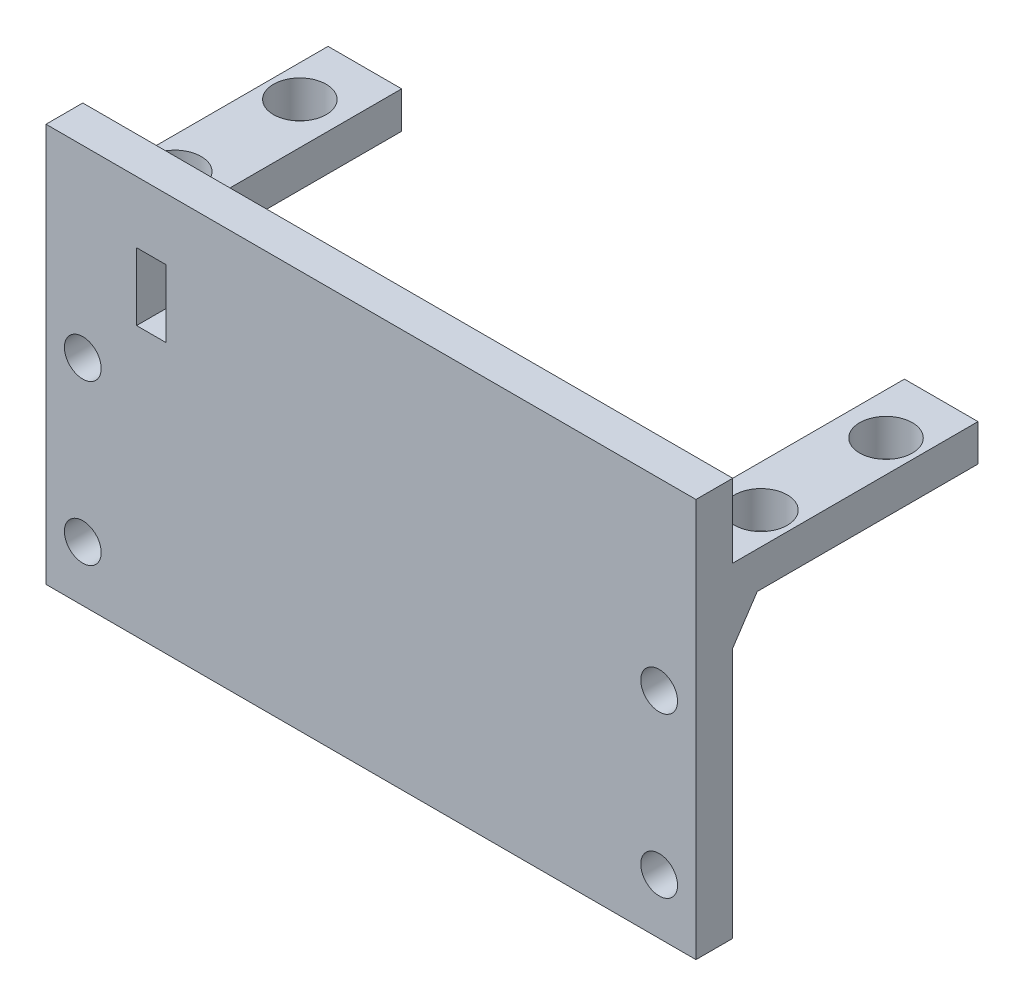
ISO-10303-21;
HEADER;
FILE_DESCRIPTION(('STEP AP214'),'2;1');
FILE_NAME('part.step','',(''),(''),'','','');
FILE_SCHEMA(('AUTOMOTIVE_DESIGN { 1 0 10303 214 1 1 1 1 }'));
ENDSEC;
DATA;
#1=APPLICATION_CONTEXT('core data for automotive mechanical design processes');
#2=APPLICATION_PROTOCOL_DEFINITION('international standard','automotive_design',2000,#1);
#3=PRODUCT_CONTEXT('',#1,'mechanical');
#4=PRODUCT('Part','Part','',(#3));
#5=PRODUCT_RELATED_PRODUCT_CATEGORY('part','',(#4));
#6=PRODUCT_DEFINITION_FORMATION('','',#4);
#7=PRODUCT_DEFINITION_CONTEXT('part definition',#1,'design');
#8=PRODUCT_DEFINITION('design','',#6,#7);
#9=PRODUCT_DEFINITION_SHAPE('','',#8);
#10=(LENGTH_UNIT() NAMED_UNIT(*) SI_UNIT(.MILLI.,.METRE.));
#11=(NAMED_UNIT(*) PLANE_ANGLE_UNIT() SI_UNIT($,.RADIAN.));
#12=(NAMED_UNIT(*) SI_UNIT($,.STERADIAN.) SOLID_ANGLE_UNIT());
#13=UNCERTAINTY_MEASURE_WITH_UNIT(LENGTH_MEASURE(1.E-05),#10,'distance_accuracy_value','');
#14=(GEOMETRIC_REPRESENTATION_CONTEXT(3) GLOBAL_UNCERTAINTY_ASSIGNED_CONTEXT((#13)) GLOBAL_UNIT_ASSIGNED_CONTEXT((#10,
#11,#12)) REPRESENTATION_CONTEXT('',''));
#15=CARTESIAN_POINT('',(0.,0.,0.));
#16=DIRECTION('',(0.,0.,1.));
#17=DIRECTION('',(1.,0.,0.));
#18=AXIS2_PLACEMENT_3D('',#15,#16,#17);
#19=CARTESIAN_POINT('',(0.,0.,0.));
#20=DIRECTION('',(0.,0.,1.));
#21=DIRECTION('',(1.,0.,0.));
#22=AXIS2_PLACEMENT_3D('',#19,#20,#21);
#23=PLANE('',#22);
#24=CARTESIAN_POINT('',(-13.7596567795015,4.56034482758562,0.));
#25=DIRECTION('',(0.,0.,-1.));
#26=DIRECTION('',(-1.,0.,0.));
#27=AXIS2_PLACEMENT_3D('',#24,#25,#26);
#28=CIRCLE('',#27,1.5);
#29=CARTESIAN_POINT('',(-15.2596567795015,4.56034482758562,0.));
#30=VERTEX_POINT('',#29);
#31=EDGE_CURVE('E388',#30,#30,#28,.T.);
#32=ORIENTED_EDGE('',*,*,#31,.F.);
#33=EDGE_LOOP('',(#32));
#34=FACE_BOUND('',#33,.T.);
#35=CARTESIAN_POINT('',(-13.7596567795015,-8.43965517241438,0.));
#36=DIRECTION('',(0.,0.,-1.));
#37=DIRECTION('',(-1.,0.,0.));
#38=AXIS2_PLACEMENT_3D('',#35,#36,#37);
#39=CIRCLE('',#38,1.5);
#40=CARTESIAN_POINT('',(-15.2596567795015,-8.43965517241438,0.));
#41=VERTEX_POINT('',#40);
#42=EDGE_CURVE('E386',#41,#41,#39,.T.);
#43=ORIENTED_EDGE('',*,*,#42,.F.);
#44=EDGE_LOOP('',(#43));
#45=FACE_BOUND('',#44,.T.);
#46=CARTESIAN_POINT('',(33.2403432204985,-8.43965517241438,0.));
#47=DIRECTION('',(0.,0.,-1.));
#48=DIRECTION('',(-1.,0.,0.));
#49=AXIS2_PLACEMENT_3D('',#46,#47,#48);
#50=CIRCLE('',#49,1.5);
#51=CARTESIAN_POINT('',(31.7403432204985,-8.43965517241438,0.));
#52=VERTEX_POINT('',#51);
#53=EDGE_CURVE('E383',#52,#52,#50,.T.);
#54=ORIENTED_EDGE('',*,*,#53,.F.);
#55=EDGE_LOOP('',(#54));
#56=FACE_BOUND('',#55,.T.);
#57=CARTESIAN_POINT('',(33.2403432204985,4.56034482758562,0.));
#58=DIRECTION('',(0.,0.,-1.));
#59=DIRECTION('',(-1.,0.,0.));
#60=AXIS2_PLACEMENT_3D('',#57,#58,#59);
#61=CIRCLE('',#60,1.5);
#62=CARTESIAN_POINT('',(31.7403432204985,4.56034482758562,0.));
#63=VERTEX_POINT('',#62);
#64=EDGE_CURVE('E255',#63,#63,#61,.T.);
#65=ORIENTED_EDGE('',*,*,#64,.F.);
#66=EDGE_LOOP('',(#65));
#67=FACE_BOUND('',#66,.T.);
#68=DIRECTION('',(0.,1.,0.));
#69=VECTOR('',#68,1.);
#70=CARTESIAN_POINT('',(30.2403432204985,10.5603448275856,0.));
#71=LINE('',#70,#69);
#72=CARTESIAN_POINT('',(30.2403432204985,7.56034482758562,0.));
#73=VERTEX_POINT('',#72);
#74=CARTESIAN_POINT('',(30.2403432204985,13.5603448275856,0.));
#75=VERTEX_POINT('',#74);
#76=EDGE_CURVE('E326',#73,#75,#71,.T.);
#77=ORIENTED_EDGE('',*,*,#76,.F.);
#78=DIRECTION('',(1.,0.,0.));
#79=VECTOR('',#78,1.);
#80=CARTESIAN_POINT('',(26.6347919450345,7.56034482758562,0.));
#81=LINE('',#80,#79);
#82=CARTESIAN_POINT('',(36.2403432204985,7.56034482758562,0.));
#83=VERTEX_POINT('',#82);
#84=EDGE_CURVE('E185',#73,#83,#81,.T.);
#85=ORIENTED_EDGE('',*,*,#84,.T.);
#86=DIRECTION('',(0.,1.,0.));
#87=VECTOR('',#86,1.);
#88=CARTESIAN_POINT('',(36.2403432204985,19.5603448275856,0.));
#89=LINE('',#88,#87);
#90=CARTESIAN_POINT('',(36.2403432204985,-12.9396551724144,0.));
#91=VERTEX_POINT('',#90);
#92=EDGE_CURVE('E195',#91,#83,#89,.T.);
#93=ORIENTED_EDGE('',*,*,#92,.F.);
#94=DIRECTION('',(1.,0.,0.));
#95=VECTOR('',#94,1.);
#96=CARTESIAN_POINT('',(-16.7596567795015,-12.9396551724144,0.));
#97=LINE('',#96,#95);
#98=CARTESIAN_POINT('',(-16.7596567795015,-12.9396551724144,0.));
#99=VERTEX_POINT('',#98);
#100=EDGE_CURVE('E220',#99,#91,#97,.T.);
#101=ORIENTED_EDGE('',*,*,#100,.F.);
#102=DIRECTION('',(0.,-1.,0.));
#103=VECTOR('',#102,1.);
#104=CARTESIAN_POINT('',(-16.7596567795015,19.5603448275856,0.));
#105=LINE('',#104,#103);
#106=CARTESIAN_POINT('',(-16.7596567795015,7.56034482758562,0.));
#107=VERTEX_POINT('',#106);
#108=EDGE_CURVE('E69',#107,#99,#105,.T.);
#109=ORIENTED_EDGE('',*,*,#108,.F.);
#110=DIRECTION('',(-1.,0.,0.));
#111=VECTOR('',#110,1.);
#112=CARTESIAN_POINT('',(-7.15410550403751,7.56034482758562,0.));
#113=LINE('',#112,#111);
#114=CARTESIAN_POINT('',(-10.7596567795015,7.56034482758562,0.));
#115=VERTEX_POINT('',#114);
#116=EDGE_CURVE('E374',#115,#107,#113,.T.);
#117=ORIENTED_EDGE('',*,*,#116,.F.);
#118=DIRECTION('',(0.,-1.,0.));
#119=VECTOR('',#118,1.);
#120=CARTESIAN_POINT('',(-10.7596567795015,13.5603448275856,0.));
#121=LINE('',#120,#119);
#122=CARTESIAN_POINT('',(-10.7596567795015,13.5603448275856,0.));
#123=VERTEX_POINT('',#122);
#124=EDGE_CURVE('E62',#123,#115,#121,.T.);
#125=ORIENTED_EDGE('',*,*,#124,.F.);
#126=DIRECTION('',(1.,0.,0.));
#127=VECTOR('',#126,1.);
#128=CARTESIAN_POINT('',(-16.7596567795015,13.5603448275856,0.));
#129=LINE('',#128,#127);
#130=CARTESIAN_POINT('',(-16.7596567795015,13.5603448275856,0.));
#131=VERTEX_POINT('',#130);
#132=EDGE_CURVE('E305',#131,#123,#129,.T.);
#133=ORIENTED_EDGE('',*,*,#132,.F.);
#134=CARTESIAN_POINT('',(-16.7596567795015,19.5603448275856,0.));
#135=VERTEX_POINT('',#134);
#136=EDGE_CURVE('E202',#135,#131,#105,.T.);
#137=ORIENTED_EDGE('',*,*,#136,.F.);
#138=DIRECTION('',(-1.,0.,0.));
#139=VECTOR('',#138,1.);
#140=CARTESIAN_POINT('',(-16.7596567795015,19.5603448275856,0.));
#141=LINE('',#140,#139);
#142=CARTESIAN_POINT('',(36.2403432204985,19.5603448275856,0.));
#143=VERTEX_POINT('',#142);
#144=EDGE_CURVE('E212',#143,#135,#141,.T.);
#145=ORIENTED_EDGE('',*,*,#144,.F.);
#146=CARTESIAN_POINT('',(36.2403432204985,13.5603448275856,0.));
#147=VERTEX_POINT('',#146);
#148=EDGE_CURVE('E222',#147,#143,#89,.T.);
#149=ORIENTED_EDGE('',*,*,#148,.F.);
#150=DIRECTION('',(1.,0.,0.));
#151=VECTOR('',#150,1.);
#152=CARTESIAN_POINT('',(36.2403432204985,13.5603448275856,0.));
#153=LINE('',#152,#151);
#154=EDGE_CURVE('E329',#75,#147,#153,.T.);
#155=ORIENTED_EDGE('',*,*,#154,.F.);
#156=EDGE_LOOP('',(#77,#85,#93,#101,#109,#117,#125,#133,#137,#145,#149,#155));
#157=FACE_BOUND('',#156,.T.);
#158=DIRECTION('',(0.,1.,0.));
#159=VECTOR('',#158,1.);
#160=CARTESIAN_POINT('',(-6.97278194106482,9.03354912706477,0.));
#161=LINE('',#160,#159);
#162=CARTESIAN_POINT('',(-6.97278194106482,9.03354912706477,0.));
#163=VERTEX_POINT('',#162);
#164=CARTESIAN_POINT('',(-6.97278194106482,14.5335491270648,0.));
#165=VERTEX_POINT('',#164);
#166=EDGE_CURVE('E262',#163,#165,#161,.T.);
#167=ORIENTED_EDGE('',*,*,#166,.T.);
#168=DIRECTION('',(-1.,0.,0.));
#169=VECTOR('',#168,1.);
#170=CARTESIAN_POINT('',(-6.97278194106482,14.5335491270648,0.));
#171=LINE('',#170,#169);
#172=CARTESIAN_POINT('',(-9.37278194106482,14.5335491270648,0.));
#173=VERTEX_POINT('',#172);
#174=EDGE_CURVE('E266',#165,#173,#171,.T.);
#175=ORIENTED_EDGE('',*,*,#174,.T.);
#176=DIRECTION('',(0.,-1.,0.));
#177=VECTOR('',#176,1.);
#178=CARTESIAN_POINT('',(-9.37278194106482,14.5335491270648,0.));
#179=LINE('',#178,#177);
#180=CARTESIAN_POINT('',(-9.37278194106482,9.03354912706477,0.));
#181=VERTEX_POINT('',#180);
#182=EDGE_CURVE('E271',#173,#181,#179,.T.);
#183=ORIENTED_EDGE('',*,*,#182,.T.);
#184=DIRECTION('',(1.,0.,0.));
#185=VECTOR('',#184,1.);
#186=CARTESIAN_POINT('',(-9.37278194106482,9.03354912706477,0.));
#187=LINE('',#186,#185);
#188=EDGE_CURVE('E278',#181,#163,#187,.T.);
#189=ORIENTED_EDGE('',*,*,#188,.T.);
#190=EDGE_LOOP('',(#167,#175,#183,#189));
#191=FACE_BOUND('',#190,.T.);
#192=ADVANCED_FACE('F45',(#34,#45,#56,#67,#157,#191),#23,.F.);
#193=CARTESIAN_POINT('',(0.,0.,3.));
#194=DIRECTION('',(0.,0.,1.));
#195=DIRECTION('',(1.,0.,0.));
#196=AXIS2_PLACEMENT_3D('',#193,#194,#195);
#197=PLANE('',#196);
#198=CARTESIAN_POINT('',(-13.7596567795015,4.56034482758562,3.));
#199=DIRECTION('',(0.,0.,1.));
#200=DIRECTION('',(1.,0.,0.));
#201=AXIS2_PLACEMENT_3D('',#198,#199,#200);
#202=CIRCLE('',#201,1.5);
#203=CARTESIAN_POINT('',(-12.2596567795015,4.56034482758562,3.));
#204=VERTEX_POINT('',#203);
#205=EDGE_CURVE('E49',#204,#204,#202,.T.);
#206=ORIENTED_EDGE('',*,*,#205,.F.);
#207=EDGE_LOOP('',(#206));
#208=FACE_BOUND('',#207,.T.);
#209=CARTESIAN_POINT('',(-13.7596567795015,-8.43965517241438,3.));
#210=DIRECTION('',(0.,0.,1.));
#211=DIRECTION('',(1.,0.,0.));
#212=AXIS2_PLACEMENT_3D('',#209,#210,#211);
#213=CIRCLE('',#212,1.5);
#214=CARTESIAN_POINT('',(-12.2596567795015,-8.43965517241438,3.));
#215=VERTEX_POINT('',#214);
#216=EDGE_CURVE('E257',#215,#215,#213,.T.);
#217=ORIENTED_EDGE('',*,*,#216,.F.);
#218=EDGE_LOOP('',(#217));
#219=FACE_BOUND('',#218,.T.);
#220=CARTESIAN_POINT('',(33.2403432204985,-8.43965517241438,3.));
#221=DIRECTION('',(0.,0.,1.));
#222=DIRECTION('',(1.,0.,0.));
#223=AXIS2_PLACEMENT_3D('',#220,#221,#222);
#224=CIRCLE('',#223,1.5);
#225=CARTESIAN_POINT('',(34.7403432204985,-8.43965517241438,3.));
#226=VERTEX_POINT('',#225);
#227=EDGE_CURVE('E254',#226,#226,#224,.T.);
#228=ORIENTED_EDGE('',*,*,#227,.F.);
#229=EDGE_LOOP('',(#228));
#230=FACE_BOUND('',#229,.T.);
#231=CARTESIAN_POINT('',(33.2403432204985,4.56034482758562,3.));
#232=DIRECTION('',(0.,0.,1.));
#233=DIRECTION('',(1.,0.,0.));
#234=AXIS2_PLACEMENT_3D('',#231,#232,#233);
#235=CIRCLE('',#234,1.5);
#236=CARTESIAN_POINT('',(34.7403432204985,4.56034482758562,3.));
#237=VERTEX_POINT('',#236);
#238=EDGE_CURVE('E251',#237,#237,#235,.T.);
#239=ORIENTED_EDGE('',*,*,#238,.F.);
#240=EDGE_LOOP('',(#239));
#241=FACE_BOUND('',#240,.T.);
#242=DIRECTION('',(0.,-1.,0.));
#243=VECTOR('',#242,1.);
#244=CARTESIAN_POINT('',(-16.7596567795015,19.5603448275856,3.));
#245=LINE('',#244,#243);
#246=CARTESIAN_POINT('',(-16.7596567795015,19.5603448275856,3.));
#247=VERTEX_POINT('',#246);
#248=CARTESIAN_POINT('',(-16.7596567795015,-12.9396551724144,3.));
#249=VERTEX_POINT('',#248);
#250=EDGE_CURVE('E208',#247,#249,#245,.T.);
#251=ORIENTED_EDGE('',*,*,#250,.T.);
#252=DIRECTION('',(1.,0.,0.));
#253=VECTOR('',#252,1.);
#254=CARTESIAN_POINT('',(-16.7596567795015,-12.9396551724144,3.));
#255=LINE('',#254,#253);
#256=CARTESIAN_POINT('',(36.2403432204985,-12.9396551724144,3.));
#257=VERTEX_POINT('',#256);
#258=EDGE_CURVE('E211',#249,#257,#255,.T.);
#259=ORIENTED_EDGE('',*,*,#258,.T.);
#260=DIRECTION('',(0.,1.,0.));
#261=VECTOR('',#260,1.);
#262=CARTESIAN_POINT('',(36.2403432204985,19.5603448275856,3.));
#263=LINE('',#262,#261);
#264=CARTESIAN_POINT('',(36.2403432204985,19.5603448275856,3.));
#265=VERTEX_POINT('',#264);
#266=EDGE_CURVE('E214',#257,#265,#263,.T.);
#267=ORIENTED_EDGE('',*,*,#266,.T.);
#268=DIRECTION('',(-1.,0.,0.));
#269=VECTOR('',#268,1.);
#270=CARTESIAN_POINT('',(-16.7596567795015,19.5603448275856,3.));
#271=LINE('',#270,#269);
#272=EDGE_CURVE('E216',#265,#247,#271,.T.);
#273=ORIENTED_EDGE('',*,*,#272,.T.);
#274=EDGE_LOOP('',(#251,#259,#267,#273));
#275=FACE_BOUND('',#274,.T.);
#276=DIRECTION('',(1.,0.,0.));
#277=VECTOR('',#276,1.);
#278=CARTESIAN_POINT('',(0.,14.5335491270648,3.));
#279=LINE('',#278,#277);
#280=CARTESIAN_POINT('',(-9.37278194106482,14.5335491270648,3.));
#281=VERTEX_POINT('',#280);
#282=CARTESIAN_POINT('',(-6.97278194106482,14.5335491270648,3.));
#283=VERTEX_POINT('',#282);
#284=EDGE_CURVE('E54',#281,#283,#279,.T.);
#285=ORIENTED_EDGE('',*,*,#284,.T.);
#286=DIRECTION('',(0.,-1.,0.));
#287=VECTOR('',#286,1.);
#288=CARTESIAN_POINT('',(-6.97278194106482,0.,3.));
#289=LINE('',#288,#287);
#290=CARTESIAN_POINT('',(-6.97278194106482,9.03354912706477,3.));
#291=VERTEX_POINT('',#290);
#292=EDGE_CURVE('E13',#283,#291,#289,.T.);
#293=ORIENTED_EDGE('',*,*,#292,.T.);
#294=DIRECTION('',(-1.,0.,0.));
#295=VECTOR('',#294,1.);
#296=CARTESIAN_POINT('',(0.,9.03354912706477,3.));
#297=LINE('',#296,#295);
#298=CARTESIAN_POINT('',(-9.37278194106482,9.03354912706477,3.));
#299=VERTEX_POINT('',#298);
#300=EDGE_CURVE('E235',#291,#299,#297,.T.);
#301=ORIENTED_EDGE('',*,*,#300,.T.);
#302=DIRECTION('',(0.,1.,0.));
#303=VECTOR('',#302,1.);
#304=CARTESIAN_POINT('',(-9.37278194106482,0.,3.));
#305=LINE('',#304,#303);
#306=EDGE_CURVE('E246',#299,#281,#305,.T.);
#307=ORIENTED_EDGE('',*,*,#306,.T.);
#308=EDGE_LOOP('',(#285,#293,#301,#307));
#309=FACE_BOUND('',#308,.T.);
#310=ADVANCED_FACE('F360',(#208,#219,#230,#241,#275,#309),#197,.T.);
#311=CARTESIAN_POINT('',(-16.7596567795015,19.5603448275856,3.));
#312=DIRECTION('',(1.,0.,0.));
#313=DIRECTION('',(0.,1.,0.));
#314=AXIS2_PLACEMENT_3D('',#311,#312,#313);
#315=PLANE('',#314);
#316=DIRECTION('',(0.,-0.832050294337844,0.554700196225229));
#317=VECTOR('',#316,1.);
#318=CARTESIAN_POINT('',(-16.7596567795015,7.56034482758562,0.));
#319=LINE('',#318,#317);
#320=CARTESIAN_POINT('',(-16.7596567795015,10.5603448275856,-2.));
#321=VERTEX_POINT('',#320);
#322=EDGE_CURVE('E369',#321,#107,#319,.T.);
#323=ORIENTED_EDGE('',*,*,#322,.T.);
#324=ORIENTED_EDGE('',*,*,#108,.T.);
#325=DIRECTION('',(0.,0.,-1.));
#326=VECTOR('',#325,1.);
#327=CARTESIAN_POINT('',(-16.7596567795015,-12.9396551724144,3.));
#328=LINE('',#327,#326);
#329=EDGE_CURVE('E232',#249,#99,#328,.T.);
#330=ORIENTED_EDGE('',*,*,#329,.F.);
#331=ORIENTED_EDGE('',*,*,#250,.F.);
#332=DIRECTION('',(0.,0.,-1.));
#333=VECTOR('',#332,1.);
#334=CARTESIAN_POINT('',(-16.7596567795015,19.5603448275856,3.));
#335=LINE('',#334,#333);
#336=EDGE_CURVE('E217',#247,#135,#335,.T.);
#337=ORIENTED_EDGE('',*,*,#336,.T.);
#338=ORIENTED_EDGE('',*,*,#136,.T.);
#339=DIRECTION('',(0.,0.,1.));
#340=VECTOR('',#339,1.);
#341=CARTESIAN_POINT('',(-16.7596567795015,13.5603448275856,-20.));
#342=LINE('',#341,#340);
#343=CARTESIAN_POINT('',(-16.7596567795015,13.5603448275856,-20.));
#344=VERTEX_POINT('',#343);
#345=EDGE_CURVE('E324',#344,#131,#342,.T.);
#346=ORIENTED_EDGE('',*,*,#345,.F.);
#347=DIRECTION('',(0.,1.,0.));
#348=VECTOR('',#347,1.);
#349=CARTESIAN_POINT('',(-16.7596567795015,13.5603448275856,-20.));
#350=LINE('',#349,#348);
#351=CARTESIAN_POINT('',(-16.7596567795015,10.5603448275856,-20.));
#352=VERTEX_POINT('',#351);
#353=EDGE_CURVE('E306',#352,#344,#350,.T.);
#354=ORIENTED_EDGE('',*,*,#353,.F.);
#355=DIRECTION('',(0.,0.,1.));
#356=VECTOR('',#355,1.);
#357=CARTESIAN_POINT('',(-16.7596567795015,10.5603448275856,-20.));
#358=LINE('',#357,#356);
#359=EDGE_CURVE('E315',#352,#321,#358,.T.);
#360=ORIENTED_EDGE('',*,*,#359,.T.);
#361=EDGE_LOOP('',(#323,#324,#330,#331,#337,#338,#346,#354,#360));
#362=FACE_BOUND('',#361,.T.);
#363=ADVANCED_FACE('F47',(#362),#315,.F.);
#364=CARTESIAN_POINT('',(-16.7596567795015,-12.9396551724144,3.));
#365=DIRECTION('',(0.,1.,0.));
#366=DIRECTION('',(0.,0.,1.));
#367=AXIS2_PLACEMENT_3D('',#364,#365,#366);
#368=PLANE('',#367);
#369=ORIENTED_EDGE('',*,*,#100,.T.);
#370=DIRECTION('',(0.,0.,-1.));
#371=VECTOR('',#370,1.);
#372=CARTESIAN_POINT('',(36.2403432204985,-12.9396551724144,3.));
#373=LINE('',#372,#371);
#374=EDGE_CURVE('E230',#257,#91,#373,.T.);
#375=ORIENTED_EDGE('',*,*,#374,.F.);
#376=ORIENTED_EDGE('',*,*,#258,.F.);
#377=ORIENTED_EDGE('',*,*,#329,.T.);
#378=EDGE_LOOP('',(#369,#375,#376,#377));
#379=FACE_BOUND('',#378,.T.);
#380=ADVANCED_FACE('F365',(#379),#368,.F.);
#381=CARTESIAN_POINT('',(36.2403432204985,19.5603448275856,3.));
#382=DIRECTION('',(-1.,0.,0.));
#383=DIRECTION('',(0.,-1.,0.));
#384=AXIS2_PLACEMENT_3D('',#381,#382,#383);
#385=PLANE('',#384);
#386=ORIENTED_EDGE('',*,*,#92,.T.);
#387=DIRECTION('',(0.,0.832050294337844,-0.554700196225229));
#388=VECTOR('',#387,1.);
#389=CARTESIAN_POINT('',(36.2403432204985,7.56034482758562,0.));
#390=LINE('',#389,#388);
#391=CARTESIAN_POINT('',(36.2403432204985,10.5603448275856,-2.));
#392=VERTEX_POINT('',#391);
#393=EDGE_CURVE('E177',#83,#392,#390,.T.);
#394=ORIENTED_EDGE('',*,*,#393,.T.);
#395=DIRECTION('',(0.,0.,1.));
#396=VECTOR('',#395,1.);
#397=CARTESIAN_POINT('',(36.2403432204985,10.5603448275856,-20.));
#398=LINE('',#397,#396);
#399=CARTESIAN_POINT('',(36.2403432204985,10.5603448275856,-20.));
#400=VERTEX_POINT('',#399);
#401=EDGE_CURVE('E192',#400,#392,#398,.T.);
#402=ORIENTED_EDGE('',*,*,#401,.F.);
#403=DIRECTION('',(0.,-1.,0.));
#404=VECTOR('',#403,1.);
#405=CARTESIAN_POINT('',(36.2403432204985,10.5603448275856,-20.));
#406=LINE('',#405,#404);
#407=CARTESIAN_POINT('',(36.2403432204985,13.5603448275856,-20.));
#408=VERTEX_POINT('',#407);
#409=EDGE_CURVE('E327',#408,#400,#406,.T.);
#410=ORIENTED_EDGE('',*,*,#409,.F.);
#411=DIRECTION('',(0.,0.,1.));
#412=VECTOR('',#411,1.);
#413=CARTESIAN_POINT('',(36.2403432204985,13.5603448275856,-20.));
#414=LINE('',#413,#412);
#415=EDGE_CURVE('E335',#408,#147,#414,.T.);
#416=ORIENTED_EDGE('',*,*,#415,.T.);
#417=ORIENTED_EDGE('',*,*,#148,.T.);
#418=DIRECTION('',(0.,0.,-1.));
#419=VECTOR('',#418,1.);
#420=CARTESIAN_POINT('',(36.2403432204985,19.5603448275856,3.));
#421=LINE('',#420,#419);
#422=EDGE_CURVE('E227',#265,#143,#421,.T.);
#423=ORIENTED_EDGE('',*,*,#422,.F.);
#424=ORIENTED_EDGE('',*,*,#266,.F.);
#425=ORIENTED_EDGE('',*,*,#374,.T.);
#426=EDGE_LOOP('',(#386,#394,#402,#410,#416,#417,#423,#424,#425));
#427=FACE_BOUND('',#426,.T.);
#428=ADVANCED_FACE('F190',(#427),#385,.F.);
#429=CARTESIAN_POINT('',(-16.7596567795015,19.5603448275856,3.));
#430=DIRECTION('',(0.,-1.,0.));
#431=DIRECTION('',(0.,0.,-1.));
#432=AXIS2_PLACEMENT_3D('',#429,#430,#431);
#433=PLANE('',#432);
#434=ORIENTED_EDGE('',*,*,#144,.T.);
#435=ORIENTED_EDGE('',*,*,#336,.F.);
#436=ORIENTED_EDGE('',*,*,#272,.F.);
#437=ORIENTED_EDGE('',*,*,#422,.T.);
#438=EDGE_LOOP('',(#434,#435,#436,#437));
#439=FACE_BOUND('',#438,.T.);
#440=ADVANCED_FACE('F356',(#439),#433,.F.);
#441=CARTESIAN_POINT('',(36.2403432204985,10.5603448275856,-20.));
#442=DIRECTION('',(0.,1.,0.));
#443=DIRECTION('',(0.,0.,1.));
#444=AXIS2_PLACEMENT_3D('',#441,#442,#443);
#445=PLANE('',#444);
#446=CARTESIAN_POINT('',(33.6403432204985,10.5603448275856,-15.0999999999998));
#447=DIRECTION('',(0.,1.,0.));
#448=DIRECTION('',(0.,0.,1.));
#449=AXIS2_PLACEMENT_3D('',#446,#447,#448);
#450=CIRCLE('',#449,2.15);
#451=CARTESIAN_POINT('',(33.6403432204985,10.5603448275856,-12.9499999999998));
#452=VERTEX_POINT('',#451);
#453=EDGE_CURVE('E302',#452,#452,#450,.T.);
#454=ORIENTED_EDGE('',*,*,#453,.T.);
#455=EDGE_LOOP('',(#454));
#456=FACE_BOUND('',#455,.T.);
#457=CARTESIAN_POINT('',(33.6403432204985,10.5603448275856,-4.89999999999984));
#458=DIRECTION('',(0.,1.,0.));
#459=DIRECTION('',(0.,0.,1.));
#460=AXIS2_PLACEMENT_3D('',#457,#458,#459);
#461=CIRCLE('',#460,2.15);
#462=CARTESIAN_POINT('',(33.6403432204985,10.5603448275856,-2.74999999999984));
#463=VERTEX_POINT('',#462);
#464=EDGE_CURVE('E243',#463,#463,#461,.T.);
#465=ORIENTED_EDGE('',*,*,#464,.T.);
#466=EDGE_LOOP('',(#465));
#467=FACE_BOUND('',#466,.T.);
#468=ORIENTED_EDGE('',*,*,#401,.T.);
#469=DIRECTION('',(1.,0.,0.));
#470=VECTOR('',#469,1.);
#471=CARTESIAN_POINT('',(26.6347919450345,10.5603448275856,-2.));
#472=LINE('',#471,#470);
#473=CARTESIAN_POINT('',(30.2403432204985,10.5603448275856,-2.));
#474=VERTEX_POINT('',#473);
#475=EDGE_CURVE('E173',#474,#392,#472,.T.);
#476=ORIENTED_EDGE('',*,*,#475,.F.);
#477=DIRECTION('',(0.,0.,1.));
#478=VECTOR('',#477,1.);
#479=CARTESIAN_POINT('',(30.2403432204985,10.5603448275856,-20.));
#480=LINE('',#479,#478);
#481=CARTESIAN_POINT('',(30.2403432204985,10.5603448275856,-20.));
#482=VERTEX_POINT('',#481);
#483=EDGE_CURVE('E200',#482,#474,#480,.T.);
#484=ORIENTED_EDGE('',*,*,#483,.F.);
#485=DIRECTION('',(-1.,0.,0.));
#486=VECTOR('',#485,1.);
#487=CARTESIAN_POINT('',(36.2403432204985,10.5603448275856,-20.));
#488=LINE('',#487,#486);
#489=EDGE_CURVE('E198',#400,#482,#488,.T.);
#490=ORIENTED_EDGE('',*,*,#489,.F.);
#491=EDGE_LOOP('',(#468,#476,#484,#490));
#492=FACE_BOUND('',#491,.T.);
#493=ADVANCED_FACE('F197',(#456,#467,#492),#445,.F.);
#494=CARTESIAN_POINT('',(30.2403432204985,10.5603448275856,-20.));
#495=DIRECTION('',(1.,0.,0.));
#496=DIRECTION('',(0.,0.,-1.));
#497=AXIS2_PLACEMENT_3D('',#494,#495,#496);
#498=PLANE('',#497);
#499=ORIENTED_EDGE('',*,*,#76,.T.);
#500=DIRECTION('',(0.,0.,1.));
#501=VECTOR('',#500,1.);
#502=CARTESIAN_POINT('',(30.2403432204985,13.5603448275856,-20.));
#503=LINE('',#502,#501);
#504=CARTESIAN_POINT('',(30.2403432204985,13.5603448275856,-20.));
#505=VERTEX_POINT('',#504);
#506=EDGE_CURVE('E204',#505,#75,#503,.T.);
#507=ORIENTED_EDGE('',*,*,#506,.F.);
#508=DIRECTION('',(0.,1.,0.));
#509=VECTOR('',#508,1.);
#510=CARTESIAN_POINT('',(30.2403432204985,10.5603448275856,-20.));
#511=LINE('',#510,#509);
#512=EDGE_CURVE('E331',#482,#505,#511,.T.);
#513=ORIENTED_EDGE('',*,*,#512,.F.);
#514=ORIENTED_EDGE('',*,*,#483,.T.);
#515=DIRECTION('',(0.,-0.832050294337844,0.554700196225229));
#516=VECTOR('',#515,1.);
#517=CARTESIAN_POINT('',(30.2403432204985,7.56034482758562,0.));
#518=LINE('',#517,#516);
#519=EDGE_CURVE('E180',#474,#73,#518,.T.);
#520=ORIENTED_EDGE('',*,*,#519,.T.);
#521=EDGE_LOOP('',(#499,#507,#513,#514,#520));
#522=FACE_BOUND('',#521,.T.);
#523=ADVANCED_FACE('F349',(#522),#498,.F.);
#524=CARTESIAN_POINT('',(36.2403432204985,13.5603448275856,-20.));
#525=DIRECTION('',(0.,-1.,0.));
#526=DIRECTION('',(0.,0.,-1.));
#527=AXIS2_PLACEMENT_3D('',#524,#525,#526);
#528=PLANE('',#527);
#529=CARTESIAN_POINT('',(33.6403432204985,13.5603448275856,-15.0999999999998));
#530=DIRECTION('',(0.,1.,0.));
#531=DIRECTION('',(0.,0.,1.));
#532=AXIS2_PLACEMENT_3D('',#529,#530,#531);
#533=CIRCLE('',#532,2.15);
#534=CARTESIAN_POINT('',(33.6403432204985,13.5603448275856,-12.9499999999998));
#535=VERTEX_POINT('',#534);
#536=EDGE_CURVE('E293',#535,#535,#533,.T.);
#537=ORIENTED_EDGE('',*,*,#536,.F.);
#538=EDGE_LOOP('',(#537));
#539=FACE_BOUND('',#538,.T.);
#540=CARTESIAN_POINT('',(33.6403432204985,13.5603448275856,-4.89999999999984));
#541=DIRECTION('',(0.,1.,0.));
#542=DIRECTION('',(0.,0.,1.));
#543=AXIS2_PLACEMENT_3D('',#540,#541,#542);
#544=CIRCLE('',#543,2.15);
#545=CARTESIAN_POINT('',(33.6403432204985,13.5603448275856,-2.74999999999984));
#546=VERTEX_POINT('',#545);
#547=EDGE_CURVE('E240',#546,#546,#544,.T.);
#548=ORIENTED_EDGE('',*,*,#547,.F.);
#549=EDGE_LOOP('',(#548));
#550=FACE_BOUND('',#549,.T.);
#551=ORIENTED_EDGE('',*,*,#154,.T.);
#552=ORIENTED_EDGE('',*,*,#415,.F.);
#553=DIRECTION('',(1.,0.,0.));
#554=VECTOR('',#553,1.);
#555=CARTESIAN_POINT('',(36.2403432204985,13.5603448275856,-20.));
#556=LINE('',#555,#554);
#557=EDGE_CURVE('E333',#505,#408,#556,.T.);
#558=ORIENTED_EDGE('',*,*,#557,.F.);
#559=ORIENTED_EDGE('',*,*,#506,.T.);
#560=EDGE_LOOP('',(#551,#552,#558,#559));
#561=FACE_BOUND('',#560,.T.);
#562=ADVANCED_FACE('F345',(#539,#550,#561),#528,.F.);
#563=CARTESIAN_POINT('',(0.,0.,-20.));
#564=DIRECTION('',(0.,0.,1.));
#565=DIRECTION('',(1.,0.,0.));
#566=AXIS2_PLACEMENT_3D('',#563,#564,#565);
#567=PLANE('',#566);
#568=ORIENTED_EDGE('',*,*,#409,.T.);
#569=ORIENTED_EDGE('',*,*,#489,.T.);
#570=ORIENTED_EDGE('',*,*,#512,.T.);
#571=ORIENTED_EDGE('',*,*,#557,.T.);
#572=EDGE_LOOP('',(#568,#569,#570,#571));
#573=FACE_BOUND('',#572,.T.);
#574=ADVANCED_FACE('F408',(#573),#567,.F.);
#575=CARTESIAN_POINT('',(-16.7596567795015,13.5603448275856,-20.));
#576=DIRECTION('',(0.,-1.,0.));
#577=DIRECTION('',(0.,0.,-1.));
#578=AXIS2_PLACEMENT_3D('',#575,#576,#577);
#579=PLANE('',#578);
#580=CARTESIAN_POINT('',(-14.1596567795014,13.5603448275856,-4.89999999999984));
#581=DIRECTION('',(0.,1.,0.));
#582=DIRECTION('',(0.,0.,1.));
#583=AXIS2_PLACEMENT_3D('',#580,#581,#582);
#584=CIRCLE('',#583,2.15);
#585=CARTESIAN_POINT('',(-14.1596567795014,13.5603448275856,-2.74999999999984));
#586=VERTEX_POINT('',#585);
#587=EDGE_CURVE('E292',#586,#586,#584,.T.);
#588=ORIENTED_EDGE('',*,*,#587,.F.);
#589=EDGE_LOOP('',(#588));
#590=FACE_BOUND('',#589,.T.);
#591=CARTESIAN_POINT('',(-14.1596567795014,13.5603448275856,-15.0999999999998));
#592=DIRECTION('',(0.,1.,0.));
#593=DIRECTION('',(0.,0.,1.));
#594=AXIS2_PLACEMENT_3D('',#591,#592,#593);
#595=CIRCLE('',#594,2.15);
#596=CARTESIAN_POINT('',(-14.1596567795014,13.5603448275856,-12.9499999999998));
#597=VERTEX_POINT('',#596);
#598=EDGE_CURVE('E289',#597,#597,#595,.T.);
#599=ORIENTED_EDGE('',*,*,#598,.F.);
#600=EDGE_LOOP('',(#599));
#601=FACE_BOUND('',#600,.T.);
#602=ORIENTED_EDGE('',*,*,#132,.T.);
#603=DIRECTION('',(0.,0.,1.));
#604=VECTOR('',#603,1.);
#605=CARTESIAN_POINT('',(-10.7596567795015,13.5603448275856,-20.));
#606=LINE('',#605,#604);
#607=CARTESIAN_POINT('',(-10.7596567795015,13.5603448275856,-20.));
#608=VERTEX_POINT('',#607);
#609=EDGE_CURVE('E322',#608,#123,#606,.T.);
#610=ORIENTED_EDGE('',*,*,#609,.F.);
#611=DIRECTION('',(1.,0.,0.));
#612=VECTOR('',#611,1.);
#613=CARTESIAN_POINT('',(-16.7596567795015,13.5603448275856,-20.));
#614=LINE('',#613,#612);
#615=EDGE_CURVE('E309',#344,#608,#614,.T.);
#616=ORIENTED_EDGE('',*,*,#615,.F.);
#617=ORIENTED_EDGE('',*,*,#345,.T.);
#618=EDGE_LOOP('',(#602,#610,#616,#617));
#619=FACE_BOUND('',#618,.T.);
#620=ADVANCED_FACE('F406',(#590,#601,#619),#579,.F.);
#621=CARTESIAN_POINT('',(-10.7596567795015,13.5603448275856,-20.));
#622=DIRECTION('',(-1.,0.,0.));
#623=DIRECTION('',(0.,0.,1.));
#624=AXIS2_PLACEMENT_3D('',#621,#622,#623);
#625=PLANE('',#624);
#626=ORIENTED_EDGE('',*,*,#124,.T.);
#627=DIRECTION('',(0.,0.832050294337844,-0.554700196225229));
#628=VECTOR('',#627,1.);
#629=CARTESIAN_POINT('',(-10.7596567795015,7.56034482758562,0.));
#630=LINE('',#629,#628);
#631=CARTESIAN_POINT('',(-10.7596567795015,10.5603448275856,-2.));
#632=VERTEX_POINT('',#631);
#633=EDGE_CURVE('E381',#115,#632,#630,.T.);
#634=ORIENTED_EDGE('',*,*,#633,.T.);
#635=DIRECTION('',(0.,0.,1.));
#636=VECTOR('',#635,1.);
#637=CARTESIAN_POINT('',(-10.7596567795015,10.5603448275856,-20.));
#638=LINE('',#637,#636);
#639=CARTESIAN_POINT('',(-10.7596567795015,10.5603448275856,-20.));
#640=VERTEX_POINT('',#639);
#641=EDGE_CURVE('E320',#640,#632,#638,.T.);
#642=ORIENTED_EDGE('',*,*,#641,.F.);
#643=DIRECTION('',(0.,-1.,0.));
#644=VECTOR('',#643,1.);
#645=CARTESIAN_POINT('',(-10.7596567795015,13.5603448275856,-20.));
#646=LINE('',#645,#644);
#647=EDGE_CURVE('E311',#608,#640,#646,.T.);
#648=ORIENTED_EDGE('',*,*,#647,.F.);
#649=ORIENTED_EDGE('',*,*,#609,.T.);
#650=EDGE_LOOP('',(#626,#634,#642,#648,#649));
#651=FACE_BOUND('',#650,.T.);
#652=ADVANCED_FACE('F394',(#651),#625,.F.);
#653=CARTESIAN_POINT('',(-16.7596567795015,10.5603448275856,-20.));
#654=DIRECTION('',(0.,1.,0.));
#655=DIRECTION('',(0.,0.,1.));
#656=AXIS2_PLACEMENT_3D('',#653,#654,#655);
#657=PLANE('',#656);
#658=CARTESIAN_POINT('',(-14.1596567795014,10.5603448275856,-4.89999999999984));
#659=DIRECTION('',(0.,1.,0.));
#660=DIRECTION('',(0.,0.,1.));
#661=AXIS2_PLACEMENT_3D('',#658,#659,#660);
#662=CIRCLE('',#661,2.15);
#663=CARTESIAN_POINT('',(-14.1596567795014,10.5603448275856,-2.74999999999984));
#664=VERTEX_POINT('',#663);
#665=EDGE_CURVE('E239',#664,#664,#662,.T.);
#666=ORIENTED_EDGE('',*,*,#665,.T.);
#667=EDGE_LOOP('',(#666));
#668=FACE_BOUND('',#667,.T.);
#669=CARTESIAN_POINT('',(-14.1596567795014,10.5603448275856,-15.0999999999998));
#670=DIRECTION('',(0.,1.,0.));
#671=DIRECTION('',(0.,0.,1.));
#672=AXIS2_PLACEMENT_3D('',#669,#670,#671);
#673=CIRCLE('',#672,2.15);
#674=CARTESIAN_POINT('',(-14.1596567795014,10.5603448275856,-12.9499999999998));
#675=VERTEX_POINT('',#674);
#676=EDGE_CURVE('E236',#675,#675,#673,.T.);
#677=ORIENTED_EDGE('',*,*,#676,.T.);
#678=EDGE_LOOP('',(#677));
#679=FACE_BOUND('',#678,.T.);
#680=ORIENTED_EDGE('',*,*,#641,.T.);
#681=DIRECTION('',(-1.,0.,0.));
#682=VECTOR('',#681,1.);
#683=CARTESIAN_POINT('',(-7.15410550403751,10.5603448275856,-2.));
#684=LINE('',#683,#682);
#685=EDGE_CURVE('E376',#632,#321,#684,.T.);
#686=ORIENTED_EDGE('',*,*,#685,.T.);
#687=ORIENTED_EDGE('',*,*,#359,.F.);
#688=DIRECTION('',(-1.,0.,0.));
#689=VECTOR('',#688,1.);
#690=CARTESIAN_POINT('',(-16.7596567795015,10.5603448275856,-20.));
#691=LINE('',#690,#689);
#692=EDGE_CURVE('E313',#640,#352,#691,.T.);
#693=ORIENTED_EDGE('',*,*,#692,.F.);
#694=EDGE_LOOP('',(#680,#686,#687,#693));
#695=FACE_BOUND('',#694,.T.);
#696=ADVANCED_FACE('F399',(#668,#679,#695),#657,.F.);
#697=CARTESIAN_POINT('',(0.,0.,-20.));
#698=DIRECTION('',(0.,0.,1.));
#699=DIRECTION('',(1.,0.,0.));
#700=AXIS2_PLACEMENT_3D('',#697,#698,#699);
#701=PLANE('',#700);
#702=ORIENTED_EDGE('',*,*,#353,.T.);
#703=ORIENTED_EDGE('',*,*,#615,.T.);
#704=ORIENTED_EDGE('',*,*,#647,.T.);
#705=ORIENTED_EDGE('',*,*,#692,.T.);
#706=EDGE_LOOP('',(#702,#703,#704,#705));
#707=FACE_BOUND('',#706,.T.);
#708=ADVANCED_FACE('F401',(#707),#701,.F.);
#709=CARTESIAN_POINT('',(-14.1596567795014,3.56034482758562,-15.0999999999998));
#710=DIRECTION('',(0.,1.,0.));
#711=DIRECTION('',(0.,0.,1.));
#712=AXIS2_PLACEMENT_3D('',#709,#710,#711);
#713=CYLINDRICAL_SURFACE('',#712,2.15);
#714=ORIENTED_EDGE('',*,*,#598,.T.);
#715=EDGE_LOOP('',(#714));
#716=FACE_BOUND('',#715,.T.);
#717=ORIENTED_EDGE('',*,*,#676,.F.);
#718=EDGE_LOOP('',(#717));
#719=FACE_BOUND('',#718,.T.);
#720=ADVANCED_FACE('F607',(#716,#719),#713,.F.);
#721=CARTESIAN_POINT('',(-14.1596567795014,3.56034482758562,-4.89999999999984));
#722=DIRECTION('',(0.,1.,0.));
#723=DIRECTION('',(0.,0.,1.));
#724=AXIS2_PLACEMENT_3D('',#721,#722,#723);
#725=CYLINDRICAL_SURFACE('',#724,2.15);
#726=ORIENTED_EDGE('',*,*,#587,.T.);
#727=EDGE_LOOP('',(#726));
#728=FACE_BOUND('',#727,.T.);
#729=ORIENTED_EDGE('',*,*,#665,.F.);
#730=EDGE_LOOP('',(#729));
#731=FACE_BOUND('',#730,.T.);
#732=ADVANCED_FACE('F598',(#728,#731),#725,.F.);
#733=CARTESIAN_POINT('',(33.6403432204985,3.56034482758562,-4.89999999999984));
#734=DIRECTION('',(0.,1.,0.));
#735=DIRECTION('',(0.,0.,1.));
#736=AXIS2_PLACEMENT_3D('',#733,#734,#735);
#737=CYLINDRICAL_SURFACE('',#736,2.15);
#738=ORIENTED_EDGE('',*,*,#547,.T.);
#739=EDGE_LOOP('',(#738));
#740=FACE_BOUND('',#739,.T.);
#741=ORIENTED_EDGE('',*,*,#464,.F.);
#742=EDGE_LOOP('',(#741));
#743=FACE_BOUND('',#742,.T.);
#744=ADVANCED_FACE('F589',(#740,#743),#737,.F.);
#745=CARTESIAN_POINT('',(33.6403432204985,3.56034482758562,-15.0999999999998));
#746=DIRECTION('',(0.,1.,0.));
#747=DIRECTION('',(0.,0.,1.));
#748=AXIS2_PLACEMENT_3D('',#745,#746,#747);
#749=CYLINDRICAL_SURFACE('',#748,2.15);
#750=ORIENTED_EDGE('',*,*,#536,.T.);
#751=EDGE_LOOP('',(#750));
#752=FACE_BOUND('',#751,.T.);
#753=ORIENTED_EDGE('',*,*,#453,.F.);
#754=EDGE_LOOP('',(#753));
#755=FACE_BOUND('',#754,.T.);
#756=ADVANCED_FACE('F572',(#752,#755),#749,.F.);
#757=CARTESIAN_POINT('',(-6.97278194106482,9.03354912706477,10.));
#758=DIRECTION('',(-1.,0.,0.));
#759=DIRECTION('',(0.,0.,1.));
#760=AXIS2_PLACEMENT_3D('',#757,#758,#759);
#761=PLANE('',#760);
#762=DIRECTION('',(0.,0.,-1.));
#763=VECTOR('',#762,1.);
#764=CARTESIAN_POINT('',(-6.97278194106482,14.5335491270648,10.));
#765=LINE('',#764,#763);
#766=EDGE_CURVE('E287',#283,#165,#765,.T.);
#767=ORIENTED_EDGE('',*,*,#766,.T.);
#768=ORIENTED_EDGE('',*,*,#166,.F.);
#769=DIRECTION('',(0.,0.,-1.));
#770=VECTOR('',#769,1.);
#771=CARTESIAN_POINT('',(-6.97278194106482,9.03354912706477,10.));
#772=LINE('',#771,#770);
#773=EDGE_CURVE('E280',#291,#163,#772,.T.);
#774=ORIENTED_EDGE('',*,*,#773,.F.);
#775=ORIENTED_EDGE('',*,*,#292,.F.);
#776=EDGE_LOOP('',(#767,#768,#774,#775));
#777=FACE_BOUND('',#776,.T.);
#778=ADVANCED_FACE('F563',(#777),#761,.T.);
#779=CARTESIAN_POINT('',(-6.97278194106482,14.5335491270648,10.));
#780=DIRECTION('',(0.,-1.,0.));
#781=DIRECTION('',(1.,0.,0.));
#782=AXIS2_PLACEMENT_3D('',#779,#780,#781);
#783=PLANE('',#782);
#784=DIRECTION('',(0.,0.,-1.));
#785=VECTOR('',#784,1.);
#786=CARTESIAN_POINT('',(-9.37278194106482,14.5335491270648,10.));
#787=LINE('',#786,#785);
#788=EDGE_CURVE('E285',#281,#173,#787,.T.);
#789=ORIENTED_EDGE('',*,*,#788,.T.);
#790=ORIENTED_EDGE('',*,*,#174,.F.);
#791=ORIENTED_EDGE('',*,*,#766,.F.);
#792=ORIENTED_EDGE('',*,*,#284,.F.);
#793=EDGE_LOOP('',(#789,#790,#791,#792));
#794=FACE_BOUND('',#793,.T.);
#795=ADVANCED_FACE('F554',(#794),#783,.T.);
#796=CARTESIAN_POINT('',(-9.37278194106482,14.5335491270648,10.));
#797=DIRECTION('',(1.,0.,0.));
#798=DIRECTION('',(0.,0.,-1.));
#799=AXIS2_PLACEMENT_3D('',#796,#797,#798);
#800=PLANE('',#799);
#801=DIRECTION('',(0.,0.,-1.));
#802=VECTOR('',#801,1.);
#803=CARTESIAN_POINT('',(-9.37278194106482,9.03354912706477,10.));
#804=LINE('',#803,#802);
#805=EDGE_CURVE('E283',#299,#181,#804,.T.);
#806=ORIENTED_EDGE('',*,*,#805,.T.);
#807=ORIENTED_EDGE('',*,*,#182,.F.);
#808=ORIENTED_EDGE('',*,*,#788,.F.);
#809=ORIENTED_EDGE('',*,*,#306,.F.);
#810=EDGE_LOOP('',(#806,#807,#808,#809));
#811=FACE_BOUND('',#810,.T.);
#812=ADVANCED_FACE('F545',(#811),#800,.T.);
#813=CARTESIAN_POINT('',(-9.37278194106482,9.03354912706477,10.));
#814=DIRECTION('',(0.,1.,0.));
#815=DIRECTION('',(0.,0.,1.));
#816=AXIS2_PLACEMENT_3D('',#813,#814,#815);
#817=PLANE('',#816);
#818=ORIENTED_EDGE('',*,*,#773,.T.);
#819=ORIENTED_EDGE('',*,*,#188,.F.);
#820=ORIENTED_EDGE('',*,*,#805,.F.);
#821=ORIENTED_EDGE('',*,*,#300,.F.);
#822=EDGE_LOOP('',(#818,#819,#820,#821));
#823=FACE_BOUND('',#822,.T.);
#824=ADVANCED_FACE('F535',(#823),#817,.T.);
#825=CARTESIAN_POINT('',(33.2403432204985,4.56034482758562,10.));
#826=DIRECTION('',(0.,0.,-1.));
#827=DIRECTION('',(-1.,0.,0.));
#828=AXIS2_PLACEMENT_3D('',#825,#826,#827);
#829=CYLINDRICAL_SURFACE('',#828,1.5);
#830=ORIENTED_EDGE('',*,*,#238,.T.);
#831=EDGE_LOOP('',(#830));
#832=FACE_BOUND('',#831,.T.);
#833=ORIENTED_EDGE('',*,*,#64,.T.);
#834=EDGE_LOOP('',(#833));
#835=FACE_BOUND('',#834,.T.);
#836=ADVANCED_FACE('F526',(#832,#835),#829,.F.);
#837=CARTESIAN_POINT('',(33.2403432204985,-8.43965517241438,10.));
#838=DIRECTION('',(0.,0.,-1.));
#839=DIRECTION('',(-1.,0.,0.));
#840=AXIS2_PLACEMENT_3D('',#837,#838,#839);
#841=CYLINDRICAL_SURFACE('',#840,1.5);
#842=ORIENTED_EDGE('',*,*,#227,.T.);
#843=EDGE_LOOP('',(#842));
#844=FACE_BOUND('',#843,.T.);
#845=ORIENTED_EDGE('',*,*,#53,.T.);
#846=EDGE_LOOP('',(#845));
#847=FACE_BOUND('',#846,.T.);
#848=ADVANCED_FACE('F518',(#844,#847),#841,.F.);
#849=CARTESIAN_POINT('',(-13.7596567795015,-8.43965517241438,10.));
#850=DIRECTION('',(0.,0.,-1.));
#851=DIRECTION('',(-1.,0.,0.));
#852=AXIS2_PLACEMENT_3D('',#849,#850,#851);
#853=CYLINDRICAL_SURFACE('',#852,1.5);
#854=ORIENTED_EDGE('',*,*,#216,.T.);
#855=EDGE_LOOP('',(#854));
#856=FACE_BOUND('',#855,.T.);
#857=ORIENTED_EDGE('',*,*,#42,.T.);
#858=EDGE_LOOP('',(#857));
#859=FACE_BOUND('',#858,.T.);
#860=ADVANCED_FACE('F511',(#856,#859),#853,.F.);
#861=CARTESIAN_POINT('',(-13.7596567795015,4.56034482758562,10.));
#862=DIRECTION('',(0.,0.,-1.));
#863=DIRECTION('',(-1.,0.,0.));
#864=AXIS2_PLACEMENT_3D('',#861,#862,#863);
#865=CYLINDRICAL_SURFACE('',#864,1.5);
#866=ORIENTED_EDGE('',*,*,#205,.T.);
#867=EDGE_LOOP('',(#866));
#868=FACE_BOUND('',#867,.T.);
#869=ORIENTED_EDGE('',*,*,#31,.T.);
#870=EDGE_LOOP('',(#869));
#871=FACE_BOUND('',#870,.T.);
#872=ADVANCED_FACE('F448',(#868,#871),#865,.F.);
#873=CARTESIAN_POINT('',(-7.15410550403751,7.56034482758562,0.));
#874=DIRECTION('',(0.,-0.554700196225229,-0.832050294337844));
#875=DIRECTION('',(0.,0.832050294337844,-0.554700196225229));
#876=AXIS2_PLACEMENT_3D('',#873,#874,#875);
#877=PLANE('',#876);
#878=ORIENTED_EDGE('',*,*,#633,.F.);
#879=ORIENTED_EDGE('',*,*,#116,.T.);
#880=ORIENTED_EDGE('',*,*,#322,.F.);
#881=ORIENTED_EDGE('',*,*,#685,.F.);
#882=EDGE_LOOP('',(#878,#879,#880,#881));
#883=FACE_BOUND('',#882,.T.);
#884=ADVANCED_FACE('F397',(#883),#877,.T.);
#885=CARTESIAN_POINT('',(26.6347919450345,7.56034482758562,0.));
#886=DIRECTION('',(0.,-0.554700196225229,-0.832050294337844));
#887=DIRECTION('',(0.,0.832050294337844,-0.554700196225229));
#888=AXIS2_PLACEMENT_3D('',#885,#886,#887);
#889=PLANE('',#888);
#890=ORIENTED_EDGE('',*,*,#519,.F.);
#891=ORIENTED_EDGE('',*,*,#475,.T.);
#892=ORIENTED_EDGE('',*,*,#393,.F.);
#893=ORIENTED_EDGE('',*,*,#84,.F.);
#894=EDGE_LOOP('',(#890,#891,#892,#893));
#895=FACE_BOUND('',#894,.T.);
#896=ADVANCED_FACE('F175',(#895),#889,.T.);
#897=CLOSED_SHELL('',(#192,#310,#363,#380,#428,#440,#493,#523,#562,#574,#620,#652,#696,#708,
#720,#732,#744,#756,#778,#795,#812,#824,#836,#848,#860,#872,#884,#896));
#898=MANIFOLD_SOLID_BREP('B2',#897);
#899=ADVANCED_BREP_SHAPE_REPRESENTATION('',(#18,#898),#14);
#900=SHAPE_DEFINITION_REPRESENTATION(#9,#899);
ENDSEC;
END-ISO-10303-21;
